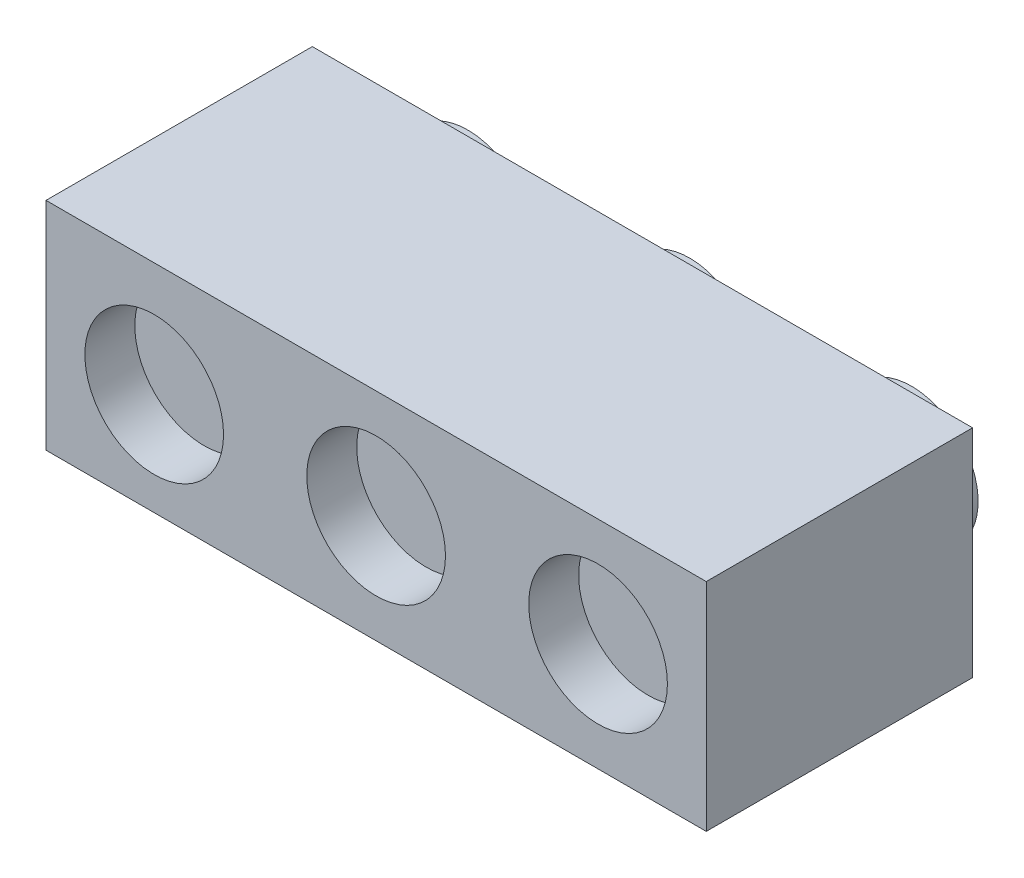
ISO-10303-21;
HEADER;
FILE_DESCRIPTION(('STEP AP214'),'2;1');
FILE_NAME('part.step','',(''),(''),'','','');
FILE_SCHEMA(('AUTOMOTIVE_DESIGN { 1 0 10303 214 1 1 1 1 }'));
ENDSEC;
DATA;
#1=APPLICATION_CONTEXT('core data for automotive mechanical design processes');
#2=APPLICATION_PROTOCOL_DEFINITION('international standard','automotive_design',2000,#1);
#3=PRODUCT_CONTEXT('',#1,'mechanical');
#4=PRODUCT('Part','Part','',(#3));
#5=PRODUCT_RELATED_PRODUCT_CATEGORY('part','',(#4));
#6=PRODUCT_DEFINITION_FORMATION('','',#4);
#7=PRODUCT_DEFINITION_CONTEXT('part definition',#1,'design');
#8=PRODUCT_DEFINITION('design','',#6,#7);
#9=PRODUCT_DEFINITION_SHAPE('','',#8);
#10=(LENGTH_UNIT() NAMED_UNIT(*) SI_UNIT(.MILLI.,.METRE.));
#11=(NAMED_UNIT(*) PLANE_ANGLE_UNIT() SI_UNIT($,.RADIAN.));
#12=(NAMED_UNIT(*) SI_UNIT($,.STERADIAN.) SOLID_ANGLE_UNIT());
#13=UNCERTAINTY_MEASURE_WITH_UNIT(LENGTH_MEASURE(1.E-05),#10,'distance_accuracy_value','');
#14=(GEOMETRIC_REPRESENTATION_CONTEXT(3) GLOBAL_UNCERTAINTY_ASSIGNED_CONTEXT((#13)) GLOBAL_UNIT_ASSIGNED_CONTEXT((#10,
#11,#12)) REPRESENTATION_CONTEXT('',''));
#15=CARTESIAN_POINT('',(0.,0.,0.));
#16=DIRECTION('',(0.,0.,1.));
#17=DIRECTION('',(1.,0.,0.));
#18=AXIS2_PLACEMENT_3D('',#15,#16,#17);
#19=CARTESIAN_POINT('',(11.9,-3.9,9.6));
#20=DIRECTION('',(-1.,0.,0.));
#21=DIRECTION('',(0.,0.,1.));
#22=AXIS2_PLACEMENT_3D('',#19,#20,#21);
#23=PLANE('',#22);
#24=DIRECTION('',(0.,1.,0.));
#25=VECTOR('',#24,1.);
#26=CARTESIAN_POINT('',(11.9,-3.9,0.));
#27=LINE('',#26,#25);
#28=CARTESIAN_POINT('',(11.9,-3.9,0.));
#29=VERTEX_POINT('',#28);
#30=CARTESIAN_POINT('',(11.9,3.9,0.));
#31=VERTEX_POINT('',#30);
#32=EDGE_CURVE('E101',#29,#31,#27,.T.);
#33=ORIENTED_EDGE('',*,*,#32,.T.);
#34=DIRECTION('',(0.,0.,-1.));
#35=VECTOR('',#34,1.);
#36=CARTESIAN_POINT('',(11.9,3.9,9.6));
#37=LINE('',#36,#35);
#38=CARTESIAN_POINT('',(11.9,3.9,9.6));
#39=VERTEX_POINT('',#38);
#40=EDGE_CURVE('E38',#39,#31,#37,.T.);
#41=ORIENTED_EDGE('',*,*,#40,.F.);
#42=DIRECTION('',(0.,1.,0.));
#43=VECTOR('',#42,1.);
#44=CARTESIAN_POINT('',(11.9,-3.9,9.6));
#45=LINE('',#44,#43);
#46=CARTESIAN_POINT('',(11.9,-3.9,9.6));
#47=VERTEX_POINT('',#46);
#48=EDGE_CURVE('E88',#47,#39,#45,.T.);
#49=ORIENTED_EDGE('',*,*,#48,.F.);
#50=DIRECTION('',(0.,0.,-1.));
#51=VECTOR('',#50,1.);
#52=CARTESIAN_POINT('',(11.9,-3.9,9.6));
#53=LINE('',#52,#51);
#54=EDGE_CURVE('E97',#47,#29,#53,.T.);
#55=ORIENTED_EDGE('',*,*,#54,.T.);
#56=EDGE_LOOP('',(#33,#41,#49,#55));
#57=FACE_BOUND('',#56,.T.);
#58=ADVANCED_FACE('F35',(#57),#23,.F.);
#59=CARTESIAN_POINT('',(-11.9,3.9,9.6));
#60=DIRECTION('',(0.,-1.,0.));
#61=DIRECTION('',(0.,0.,-1.));
#62=AXIS2_PLACEMENT_3D('',#59,#60,#61);
#63=PLANE('',#62);
#64=DIRECTION('',(-1.,0.,0.));
#65=VECTOR('',#64,1.);
#66=CARTESIAN_POINT('',(-11.9,3.9,0.));
#67=LINE('',#66,#65);
#68=CARTESIAN_POINT('',(-11.9,3.9,0.));
#69=VERTEX_POINT('',#68);
#70=EDGE_CURVE('E93',#31,#69,#67,.T.);
#71=ORIENTED_EDGE('',*,*,#70,.T.);
#72=DIRECTION('',(0.,0.,-1.));
#73=VECTOR('',#72,1.);
#74=CARTESIAN_POINT('',(-11.9,3.9,9.6));
#75=LINE('',#74,#73);
#76=CARTESIAN_POINT('',(-11.9,3.9,9.6));
#77=VERTEX_POINT('',#76);
#78=EDGE_CURVE('E91',#77,#69,#75,.T.);
#79=ORIENTED_EDGE('',*,*,#78,.F.);
#80=DIRECTION('',(-1.,0.,0.));
#81=VECTOR('',#80,1.);
#82=CARTESIAN_POINT('',(-11.9,3.9,9.6));
#83=LINE('',#82,#81);
#84=EDGE_CURVE('E83',#39,#77,#83,.T.);
#85=ORIENTED_EDGE('',*,*,#84,.F.);
#86=ORIENTED_EDGE('',*,*,#40,.T.);
#87=EDGE_LOOP('',(#71,#79,#85,#86));
#88=FACE_BOUND('',#87,.T.);
#89=ADVANCED_FACE('F92',(#88),#63,.F.);
#90=CARTESIAN_POINT('',(-11.9,-3.9,9.6));
#91=DIRECTION('',(1.,0.,0.));
#92=DIRECTION('',(0.,0.,-1.));
#93=AXIS2_PLACEMENT_3D('',#90,#91,#92);
#94=PLANE('',#93);
#95=DIRECTION('',(0.,-1.,0.));
#96=VECTOR('',#95,1.);
#97=CARTESIAN_POINT('',(-11.9,-3.9,0.));
#98=LINE('',#97,#96);
#99=CARTESIAN_POINT('',(-11.9,-3.9,0.));
#100=VERTEX_POINT('',#99);
#101=EDGE_CURVE('E69',#69,#100,#98,.T.);
#102=ORIENTED_EDGE('',*,*,#101,.T.);
#103=DIRECTION('',(0.,0.,-1.));
#104=VECTOR('',#103,1.);
#105=CARTESIAN_POINT('',(-11.9,-3.9,9.6));
#106=LINE('',#105,#104);
#107=CARTESIAN_POINT('',(-11.9,-3.9,9.6));
#108=VERTEX_POINT('',#107);
#109=EDGE_CURVE('E94',#108,#100,#106,.T.);
#110=ORIENTED_EDGE('',*,*,#109,.F.);
#111=DIRECTION('',(0.,-1.,0.));
#112=VECTOR('',#111,1.);
#113=CARTESIAN_POINT('',(-11.9,-3.9,9.6));
#114=LINE('',#113,#112);
#115=EDGE_CURVE('E86',#77,#108,#114,.T.);
#116=ORIENTED_EDGE('',*,*,#115,.F.);
#117=ORIENTED_EDGE('',*,*,#78,.T.);
#118=EDGE_LOOP('',(#102,#110,#116,#117));
#119=FACE_BOUND('',#118,.T.);
#120=ADVANCED_FACE('F95',(#119),#94,.F.);
#121=CARTESIAN_POINT('',(-11.9,-3.9,9.6));
#122=DIRECTION('',(0.,1.,0.));
#123=DIRECTION('',(0.,0.,1.));
#124=AXIS2_PLACEMENT_3D('',#121,#122,#123);
#125=PLANE('',#124);
#126=DIRECTION('',(1.,0.,0.));
#127=VECTOR('',#126,1.);
#128=CARTESIAN_POINT('',(-11.9,-3.9,0.));
#129=LINE('',#128,#127);
#130=EDGE_CURVE('E75',#100,#29,#129,.T.);
#131=ORIENTED_EDGE('',*,*,#130,.T.);
#132=ORIENTED_EDGE('',*,*,#54,.F.);
#133=DIRECTION('',(1.,0.,0.));
#134=VECTOR('',#133,1.);
#135=CARTESIAN_POINT('',(-11.9,-3.9,9.6));
#136=LINE('',#135,#134);
#137=EDGE_CURVE('E52',#108,#47,#136,.T.);
#138=ORIENTED_EDGE('',*,*,#137,.F.);
#139=ORIENTED_EDGE('',*,*,#109,.T.);
#140=EDGE_LOOP('',(#131,#132,#138,#139));
#141=FACE_BOUND('',#140,.T.);
#142=ADVANCED_FACE('F109',(#141),#125,.F.);
#143=CARTESIAN_POINT('',(0.,0.,9.6));
#144=DIRECTION('',(0.,0.,-1.));
#145=DIRECTION('',(-1.,0.,0.));
#146=AXIS2_PLACEMENT_3D('',#143,#144,#145);
#147=PLANE('',#146);
#148=CARTESIAN_POINT('',(8.,0.,9.6));
#149=DIRECTION('',(0.,0.,1.));
#150=DIRECTION('',(1.,0.,0.));
#151=AXIS2_PLACEMENT_3D('',#148,#149,#150);
#152=CIRCLE('',#151,2.5);
#153=CARTESIAN_POINT('',(10.5,0.,9.6));
#154=VERTEX_POINT('',#153);
#155=EDGE_CURVE('E136',#154,#154,#152,.T.);
#156=ORIENTED_EDGE('',*,*,#155,.F.);
#157=EDGE_LOOP('',(#156));
#158=FACE_BOUND('',#157,.T.);
#159=CARTESIAN_POINT('',(-8.,-0.211129938597843,9.6));
#160=DIRECTION('',(0.,0.,1.));
#161=DIRECTION('',(1.,0.,0.));
#162=AXIS2_PLACEMENT_3D('',#159,#160,#161);
#163=CIRCLE('',#162,2.5);
#164=CARTESIAN_POINT('',(-5.5,-0.211129938597843,9.6));
#165=VERTEX_POINT('',#164);
#166=EDGE_CURVE('E142',#165,#165,#163,.T.);
#167=ORIENTED_EDGE('',*,*,#166,.F.);
#168=EDGE_LOOP('',(#167));
#169=FACE_BOUND('',#168,.T.);
#170=CARTESIAN_POINT('',(0.,0.,9.6));
#171=DIRECTION('',(0.,0.,1.));
#172=DIRECTION('',(1.,0.,0.));
#173=AXIS2_PLACEMENT_3D('',#170,#171,#172);
#174=CIRCLE('',#173,2.5);
#175=CARTESIAN_POINT('',(2.5,0.,9.6));
#176=VERTEX_POINT('',#175);
#177=EDGE_CURVE('E130',#176,#176,#174,.T.);
#178=ORIENTED_EDGE('',*,*,#177,.F.);
#179=EDGE_LOOP('',(#178));
#180=FACE_BOUND('',#179,.T.);
#181=ORIENTED_EDGE('',*,*,#48,.T.);
#182=ORIENTED_EDGE('',*,*,#84,.T.);
#183=ORIENTED_EDGE('',*,*,#115,.T.);
#184=ORIENTED_EDGE('',*,*,#137,.T.);
#185=EDGE_LOOP('',(#181,#182,#183,#184));
#186=FACE_BOUND('',#185,.T.);
#187=ADVANCED_FACE('F84',(#158,#169,#180,#186),#147,.F.);
#188=CARTESIAN_POINT('',(0.,0.,0.));
#189=DIRECTION('',(0.,0.,-1.));
#190=DIRECTION('',(-1.,0.,0.));
#191=AXIS2_PLACEMENT_3D('',#188,#189,#190);
#192=PLANE('',#191);
#193=CARTESIAN_POINT('',(8.,0.,0.));
#194=DIRECTION('',(0.,0.,-1.));
#195=DIRECTION('',(-1.,0.,0.));
#196=AXIS2_PLACEMENT_3D('',#193,#194,#195);
#197=CIRCLE('',#196,2.4);
#198=CARTESIAN_POINT('',(5.6,0.,0.));
#199=VERTEX_POINT('',#198);
#200=EDGE_CURVE('E124',#199,#199,#197,.T.);
#201=ORIENTED_EDGE('',*,*,#200,.F.);
#202=EDGE_LOOP('',(#201));
#203=FACE_BOUND('',#202,.T.);
#204=CARTESIAN_POINT('',(-8.,0.,0.));
#205=DIRECTION('',(0.,0.,-1.));
#206=DIRECTION('',(-1.,0.,0.));
#207=AXIS2_PLACEMENT_3D('',#204,#205,#206);
#208=CIRCLE('',#207,2.4);
#209=CARTESIAN_POINT('',(-10.4,0.,0.));
#210=VERTEX_POINT('',#209);
#211=EDGE_CURVE('E118',#210,#210,#208,.T.);
#212=ORIENTED_EDGE('',*,*,#211,.F.);
#213=EDGE_LOOP('',(#212));
#214=FACE_BOUND('',#213,.T.);
#215=CARTESIAN_POINT('',(0.,0.,0.));
#216=DIRECTION('',(0.,0.,-1.));
#217=DIRECTION('',(-1.,0.,0.));
#218=AXIS2_PLACEMENT_3D('',#215,#216,#217);
#219=CIRCLE('',#218,2.4);
#220=CARTESIAN_POINT('',(-2.4,0.,0.));
#221=VERTEX_POINT('',#220);
#222=EDGE_CURVE('E11',#221,#221,#219,.T.);
#223=ORIENTED_EDGE('',*,*,#222,.F.);
#224=EDGE_LOOP('',(#223));
#225=FACE_BOUND('',#224,.T.);
#226=ORIENTED_EDGE('',*,*,#32,.F.);
#227=ORIENTED_EDGE('',*,*,#130,.F.);
#228=ORIENTED_EDGE('',*,*,#101,.F.);
#229=ORIENTED_EDGE('',*,*,#70,.F.);
#230=EDGE_LOOP('',(#226,#227,#228,#229));
#231=FACE_BOUND('',#230,.T.);
#232=ADVANCED_FACE('F112',(#203,#214,#225,#231),#192,.T.);
#233=CARTESIAN_POINT('',(0.,0.,-1.7));
#234=DIRECTION('',(0.,0.,1.));
#235=DIRECTION('',(1.,0.,0.));
#236=AXIS2_PLACEMENT_3D('',#233,#234,#235);
#237=CYLINDRICAL_SURFACE('',#236,2.4);
#238=CARTESIAN_POINT('',(0.,0.,-1.7));
#239=DIRECTION('',(0.,0.,-1.));
#240=DIRECTION('',(-1.,0.,0.));
#241=AXIS2_PLACEMENT_3D('',#238,#239,#240);
#242=CIRCLE('',#241,2.4);
#243=CARTESIAN_POINT('',(-2.4,0.,-1.7));
#244=VERTEX_POINT('',#243);
#245=EDGE_CURVE('E104',#244,#244,#242,.T.);
#246=ORIENTED_EDGE('',*,*,#245,.F.);
#247=EDGE_LOOP('',(#246));
#248=FACE_BOUND('',#247,.T.);
#249=ORIENTED_EDGE('',*,*,#222,.T.);
#250=EDGE_LOOP('',(#249));
#251=FACE_BOUND('',#250,.T.);
#252=ADVANCED_FACE('F190',(#248,#251),#237,.T.);
#253=CARTESIAN_POINT('',(0.,0.,-1.7));
#254=DIRECTION('',(0.,0.,-1.));
#255=DIRECTION('',(-1.,0.,0.));
#256=AXIS2_PLACEMENT_3D('',#253,#254,#255);
#257=PLANE('',#256);
#258=ORIENTED_EDGE('',*,*,#245,.T.);
#259=EDGE_LOOP('',(#258));
#260=FACE_BOUND('',#259,.T.);
#261=ADVANCED_FACE('F195',(#260),#257,.T.);
#262=CARTESIAN_POINT('',(-8.,0.,-1.7));
#263=DIRECTION('',(0.,0.,1.));
#264=DIRECTION('',(1.,0.,0.));
#265=AXIS2_PLACEMENT_3D('',#262,#263,#264);
#266=CYLINDRICAL_SURFACE('',#265,2.4);
#267=CARTESIAN_POINT('',(-8.,0.,-1.7));
#268=DIRECTION('',(0.,0.,-1.));
#269=DIRECTION('',(-1.,0.,0.));
#270=AXIS2_PLACEMENT_3D('',#267,#268,#269);
#271=CIRCLE('',#270,2.4);
#272=CARTESIAN_POINT('',(-10.4,0.,-1.7));
#273=VERTEX_POINT('',#272);
#274=EDGE_CURVE('E117',#273,#273,#271,.T.);
#275=ORIENTED_EDGE('',*,*,#274,.F.);
#276=EDGE_LOOP('',(#275));
#277=FACE_BOUND('',#276,.T.);
#278=ORIENTED_EDGE('',*,*,#211,.T.);
#279=EDGE_LOOP('',(#278));
#280=FACE_BOUND('',#279,.T.);
#281=ADVANCED_FACE('F199',(#277,#280),#266,.T.);
#282=CARTESIAN_POINT('',(-8.,0.,-1.7));
#283=DIRECTION('',(0.,0.,-1.));
#284=DIRECTION('',(-1.,0.,0.));
#285=AXIS2_PLACEMENT_3D('',#282,#283,#284);
#286=PLANE('',#285);
#287=ORIENTED_EDGE('',*,*,#274,.T.);
#288=EDGE_LOOP('',(#287));
#289=FACE_BOUND('',#288,.T.);
#290=ADVANCED_FACE('F203',(#289),#286,.T.);
#291=CARTESIAN_POINT('',(8.,0.,-1.7));
#292=DIRECTION('',(0.,0.,1.));
#293=DIRECTION('',(1.,0.,0.));
#294=AXIS2_PLACEMENT_3D('',#291,#292,#293);
#295=CYLINDRICAL_SURFACE('',#294,2.4);
#296=CARTESIAN_POINT('',(8.,0.,-1.7));
#297=DIRECTION('',(0.,0.,-1.));
#298=DIRECTION('',(-1.,0.,0.));
#299=AXIS2_PLACEMENT_3D('',#296,#297,#298);
#300=CIRCLE('',#299,2.4);
#301=CARTESIAN_POINT('',(5.6,0.,-1.7));
#302=VERTEX_POINT('',#301);
#303=EDGE_CURVE('E121',#302,#302,#300,.T.);
#304=ORIENTED_EDGE('',*,*,#303,.F.);
#305=EDGE_LOOP('',(#304));
#306=FACE_BOUND('',#305,.T.);
#307=ORIENTED_EDGE('',*,*,#200,.T.);
#308=EDGE_LOOP('',(#307));
#309=FACE_BOUND('',#308,.T.);
#310=ADVANCED_FACE('F174',(#306,#309),#295,.T.);
#311=CARTESIAN_POINT('',(8.,0.,-1.7));
#312=DIRECTION('',(0.,0.,-1.));
#313=DIRECTION('',(-1.,0.,0.));
#314=AXIS2_PLACEMENT_3D('',#311,#312,#313);
#315=PLANE('',#314);
#316=ORIENTED_EDGE('',*,*,#303,.T.);
#317=EDGE_LOOP('',(#316));
#318=FACE_BOUND('',#317,.T.);
#319=ADVANCED_FACE('F165',(#318),#315,.T.);
#320=CARTESIAN_POINT('',(0.,0.,7.8));
#321=DIRECTION('',(0.,0.,1.));
#322=DIRECTION('',(1.,0.,0.));
#323=AXIS2_PLACEMENT_3D('',#320,#321,#322);
#324=CYLINDRICAL_SURFACE('',#323,2.5);
#325=CARTESIAN_POINT('',(0.,0.,7.8));
#326=DIRECTION('',(0.,0.,1.));
#327=DIRECTION('',(1.,0.,0.));
#328=AXIS2_PLACEMENT_3D('',#325,#326,#327);
#329=CIRCLE('',#328,2.5);
#330=CARTESIAN_POINT('',(2.5,0.,7.8));
#331=VERTEX_POINT('',#330);
#332=EDGE_CURVE('E127',#331,#331,#329,.T.);
#333=ORIENTED_EDGE('',*,*,#332,.F.);
#334=EDGE_LOOP('',(#333));
#335=FACE_BOUND('',#334,.T.);
#336=ORIENTED_EDGE('',*,*,#177,.T.);
#337=EDGE_LOOP('',(#336));
#338=FACE_BOUND('',#337,.T.);
#339=ADVANCED_FACE('F163',(#335,#338),#324,.F.);
#340=CARTESIAN_POINT('',(0.,0.,7.8));
#341=DIRECTION('',(0.,0.,1.));
#342=DIRECTION('',(1.,0.,0.));
#343=AXIS2_PLACEMENT_3D('',#340,#341,#342);
#344=PLANE('',#343);
#345=ORIENTED_EDGE('',*,*,#332,.T.);
#346=EDGE_LOOP('',(#345));
#347=FACE_BOUND('',#346,.T.);
#348=ADVANCED_FACE('F153',(#347),#344,.T.);
#349=CARTESIAN_POINT('',(-8.,-0.211129938597843,7.8));
#350=DIRECTION('',(0.,0.,1.));
#351=DIRECTION('',(1.,0.,0.));
#352=AXIS2_PLACEMENT_3D('',#349,#350,#351);
#353=CYLINDRICAL_SURFACE('',#352,2.5);
#354=CARTESIAN_POINT('',(-8.,-0.211129938597843,7.8));
#355=DIRECTION('',(0.,0.,1.));
#356=DIRECTION('',(1.,0.,0.));
#357=AXIS2_PLACEMENT_3D('',#354,#355,#356);
#358=CIRCLE('',#357,2.5);
#359=CARTESIAN_POINT('',(-5.5,-0.211129938597843,7.8));
#360=VERTEX_POINT('',#359);
#361=EDGE_CURVE('E133',#360,#360,#358,.T.);
#362=ORIENTED_EDGE('',*,*,#361,.F.);
#363=EDGE_LOOP('',(#362));
#364=FACE_BOUND('',#363,.T.);
#365=ORIENTED_EDGE('',*,*,#166,.T.);
#366=EDGE_LOOP('',(#365));
#367=FACE_BOUND('',#366,.T.);
#368=ADVANCED_FACE('F150',(#364,#367),#353,.F.);
#369=CARTESIAN_POINT('',(-8.,-0.211129938597843,7.8));
#370=DIRECTION('',(0.,0.,1.));
#371=DIRECTION('',(1.,0.,0.));
#372=AXIS2_PLACEMENT_3D('',#369,#370,#371);
#373=PLANE('',#372);
#374=ORIENTED_EDGE('',*,*,#361,.T.);
#375=EDGE_LOOP('',(#374));
#376=FACE_BOUND('',#375,.T.);
#377=ADVANCED_FACE('F148',(#376),#373,.T.);
#378=CARTESIAN_POINT('',(8.,0.,7.8));
#379=DIRECTION('',(0.,0.,1.));
#380=DIRECTION('',(1.,0.,0.));
#381=AXIS2_PLACEMENT_3D('',#378,#379,#380);
#382=CYLINDRICAL_SURFACE('',#381,2.5);
#383=CARTESIAN_POINT('',(8.,0.,7.8));
#384=DIRECTION('',(0.,0.,1.));
#385=DIRECTION('',(1.,0.,0.));
#386=AXIS2_PLACEMENT_3D('',#383,#384,#385);
#387=CIRCLE('',#386,2.5);
#388=CARTESIAN_POINT('',(10.5,0.,7.8));
#389=VERTEX_POINT('',#388);
#390=EDGE_CURVE('E139',#389,#389,#387,.T.);
#391=ORIENTED_EDGE('',*,*,#390,.F.);
#392=EDGE_LOOP('',(#391));
#393=FACE_BOUND('',#392,.T.);
#394=ORIENTED_EDGE('',*,*,#155,.T.);
#395=EDGE_LOOP('',(#394));
#396=FACE_BOUND('',#395,.T.);
#397=ADVANCED_FACE('F260',(#393,#396),#382,.F.);
#398=CARTESIAN_POINT('',(8.,0.,7.8));
#399=DIRECTION('',(0.,0.,1.));
#400=DIRECTION('',(1.,0.,0.));
#401=AXIS2_PLACEMENT_3D('',#398,#399,#400);
#402=PLANE('',#401);
#403=ORIENTED_EDGE('',*,*,#390,.T.);
#404=EDGE_LOOP('',(#403));
#405=FACE_BOUND('',#404,.T.);
#406=ADVANCED_FACE('F269',(#405),#402,.T.);
#407=CLOSED_SHELL('',(#58,#89,#120,#142,#187,#232,#252,#261,#281,#290,#310,#319,#339,#348,#368,
#377,#397,#406));
#408=MANIFOLD_SOLID_BREP('B2',#407);
#409=ADVANCED_BREP_SHAPE_REPRESENTATION('',(#18,#408),#14);
#410=SHAPE_DEFINITION_REPRESENTATION(#9,#409);
ENDSEC;
END-ISO-10303-21;
